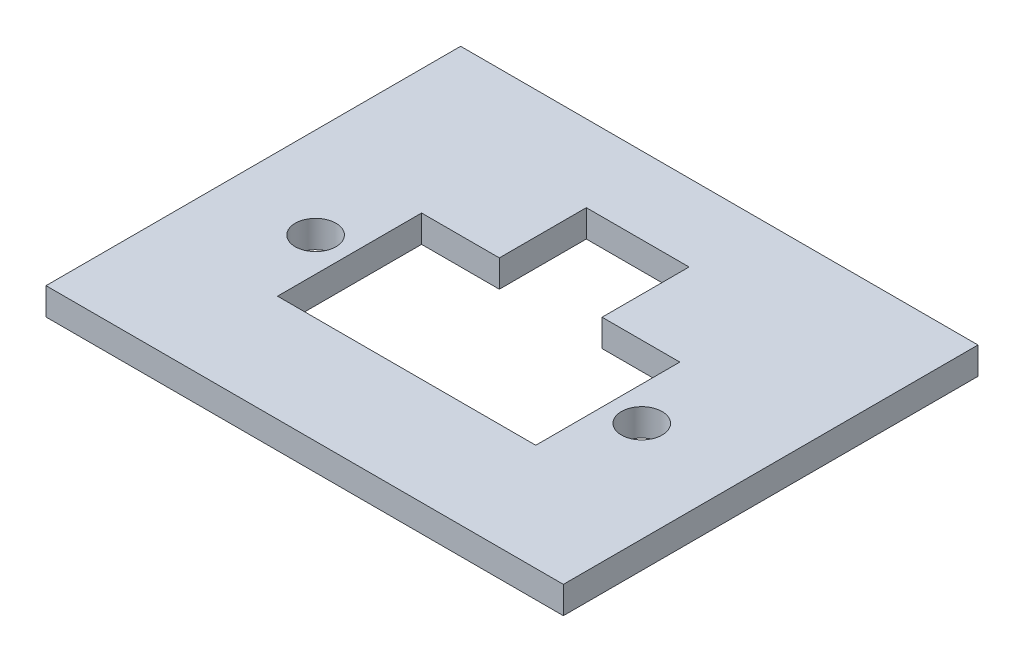
ISO-10303-21;
HEADER;
FILE_DESCRIPTION(('STEP AP214'),'2;1');
FILE_NAME('part.step','',(''),(''),'','','');
FILE_SCHEMA(('AUTOMOTIVE_DESIGN { 1 0 10303 214 1 1 1 1 }'));
ENDSEC;
DATA;
#1=APPLICATION_CONTEXT('core data for automotive mechanical design processes');
#2=APPLICATION_PROTOCOL_DEFINITION('international standard','automotive_design',2000,#1);
#3=PRODUCT_CONTEXT('',#1,'mechanical');
#4=PRODUCT('Part','Part','',(#3));
#5=PRODUCT_RELATED_PRODUCT_CATEGORY('part','',(#4));
#6=PRODUCT_DEFINITION_FORMATION('','',#4);
#7=PRODUCT_DEFINITION_CONTEXT('part definition',#1,'design');
#8=PRODUCT_DEFINITION('design','',#6,#7);
#9=PRODUCT_DEFINITION_SHAPE('','',#8);
#10=(LENGTH_UNIT() NAMED_UNIT(*) SI_UNIT(.MILLI.,.METRE.));
#11=(NAMED_UNIT(*) PLANE_ANGLE_UNIT() SI_UNIT($,.RADIAN.));
#12=(NAMED_UNIT(*) SI_UNIT($,.STERADIAN.) SOLID_ANGLE_UNIT());
#13=UNCERTAINTY_MEASURE_WITH_UNIT(LENGTH_MEASURE(1.E-05),#10,'distance_accuracy_value','');
#14=(GEOMETRIC_REPRESENTATION_CONTEXT(3) GLOBAL_UNCERTAINTY_ASSIGNED_CONTEXT((#13)) GLOBAL_UNIT_ASSIGNED_CONTEXT((#10,
#11,#12)) REPRESENTATION_CONTEXT('',''));
#15=CARTESIAN_POINT('',(0.,0.,0.));
#16=DIRECTION('',(0.,0.,1.));
#17=DIRECTION('',(1.,0.,0.));
#18=AXIS2_PLACEMENT_3D('',#15,#16,#17);
#19=CARTESIAN_POINT('',(0.,2.,-24.6604097019997));
#20=DIRECTION('',(0.,0.,1.));
#21=DIRECTION('',(1.,0.,0.));
#22=AXIS2_PLACEMENT_3D('',#19,#20,#21);
#23=PLANE('',#22);
#24=DIRECTION('',(-1.,0.,0.));
#25=VECTOR('',#24,1.);
#26=CARTESIAN_POINT('',(0.,0.,-24.6604097019997));
#27=LINE('',#26,#25);
#28=CARTESIAN_POINT('',(9.87892857226338,0.,-24.6604097019997));
#29=VERTEX_POINT('',#28);
#30=CARTESIAN_POINT('',(-28.1884503180928,0.,-24.6604097019997));
#31=VERTEX_POINT('',#30);
#32=EDGE_CURVE('E202',#29,#31,#27,.T.);
#33=ORIENTED_EDGE('',*,*,#32,.T.);
#34=DIRECTION('',(0.,-1.,0.));
#35=VECTOR('',#34,1.);
#36=CARTESIAN_POINT('',(-28.1884503180928,2.,-24.6604097019997));
#37=LINE('',#36,#35);
#38=CARTESIAN_POINT('',(-28.1884503180928,2.,-24.6604097019997));
#39=VERTEX_POINT('',#38);
#40=EDGE_CURVE('E12',#39,#31,#37,.T.);
#41=ORIENTED_EDGE('',*,*,#40,.F.);
#42=DIRECTION('',(-1.,0.,0.));
#43=VECTOR('',#42,1.);
#44=CARTESIAN_POINT('',(0.,2.,-24.6604097019997));
#45=LINE('',#44,#43);
#46=CARTESIAN_POINT('',(9.87892857226338,2.,-24.6604097019997));
#47=VERTEX_POINT('',#46);
#48=EDGE_CURVE('E186',#47,#39,#45,.T.);
#49=ORIENTED_EDGE('',*,*,#48,.F.);
#50=DIRECTION('',(0.,-1.,0.));
#51=VECTOR('',#50,1.);
#52=CARTESIAN_POINT('',(9.87892857226338,2.,-24.6604097019997));
#53=LINE('',#52,#51);
#54=EDGE_CURVE('E213',#47,#29,#53,.T.);
#55=ORIENTED_EDGE('',*,*,#54,.T.);
#56=EDGE_LOOP('',(#33,#41,#49,#55));
#57=FACE_BOUND('',#56,.T.);
#58=ADVANCED_FACE('F35',(#57),#23,.F.);
#59=CARTESIAN_POINT('',(-28.1884503180928,2.,0.));
#60=DIRECTION('',(1.,0.,0.));
#61=DIRECTION('',(0.,0.,-1.));
#62=AXIS2_PLACEMENT_3D('',#59,#60,#61);
#63=PLANE('',#62);
#64=DIRECTION('',(0.,0.,1.));
#65=VECTOR('',#64,1.);
#66=CARTESIAN_POINT('',(-28.1884503180928,0.,0.));
#67=LINE('',#66,#65);
#68=CARTESIAN_POINT('',(-28.1884503180928,0.,5.84813558094167));
#69=VERTEX_POINT('',#68);
#70=EDGE_CURVE('E205',#31,#69,#67,.T.);
#71=ORIENTED_EDGE('',*,*,#70,.T.);
#72=DIRECTION('',(0.,-1.,0.));
#73=VECTOR('',#72,1.);
#74=CARTESIAN_POINT('',(-28.1884503180928,2.,5.84813558094167));
#75=LINE('',#74,#73);
#76=CARTESIAN_POINT('',(-28.1884503180928,2.,5.84813558094167));
#77=VERTEX_POINT('',#76);
#78=EDGE_CURVE('E44',#77,#69,#75,.T.);
#79=ORIENTED_EDGE('',*,*,#78,.F.);
#80=DIRECTION('',(0.,0.,1.));
#81=VECTOR('',#80,1.);
#82=CARTESIAN_POINT('',(-28.1884503180928,2.,0.));
#83=LINE('',#82,#81);
#84=EDGE_CURVE('E189',#39,#77,#83,.T.);
#85=ORIENTED_EDGE('',*,*,#84,.F.);
#86=ORIENTED_EDGE('',*,*,#40,.T.);
#87=EDGE_LOOP('',(#71,#79,#85,#86));
#88=FACE_BOUND('',#87,.T.);
#89=ADVANCED_FACE('F256',(#88),#63,.F.);
#90=CARTESIAN_POINT('',(0.,2.,5.84813558094167));
#91=DIRECTION('',(0.,0.,1.));
#92=DIRECTION('',(1.,0.,0.));
#93=AXIS2_PLACEMENT_3D('',#90,#91,#92);
#94=PLANE('',#93);
#95=DIRECTION('',(-1.,0.,0.));
#96=VECTOR('',#95,1.);
#97=CARTESIAN_POINT('',(0.,0.,5.84813558094167));
#98=LINE('',#97,#96);
#99=CARTESIAN_POINT('',(9.87892857226338,0.,5.84813558094167));
#100=VERTEX_POINT('',#99);
#101=EDGE_CURVE('E208',#100,#69,#98,.T.);
#102=ORIENTED_EDGE('',*,*,#101,.F.);
#103=DIRECTION('',(0.,-1.,0.));
#104=VECTOR('',#103,1.);
#105=CARTESIAN_POINT('',(9.87892857226338,2.,5.84813558094167));
#106=LINE('',#105,#104);
#107=CARTESIAN_POINT('',(9.87892857226338,2.,5.84813558094167));
#108=VERTEX_POINT('',#107);
#109=EDGE_CURVE('E215',#108,#100,#106,.T.);
#110=ORIENTED_EDGE('',*,*,#109,.F.);
#111=DIRECTION('',(-1.,0.,0.));
#112=VECTOR('',#111,1.);
#113=CARTESIAN_POINT('',(0.,2.,5.84813558094167));
#114=LINE('',#113,#112);
#115=EDGE_CURVE('E191',#108,#77,#114,.T.);
#116=ORIENTED_EDGE('',*,*,#115,.T.);
#117=ORIENTED_EDGE('',*,*,#78,.T.);
#118=EDGE_LOOP('',(#102,#110,#116,#117));
#119=FACE_BOUND('',#118,.T.);
#120=ADVANCED_FACE('F262',(#119),#94,.T.);
#121=CARTESIAN_POINT('',(-13.28,2.,0.));
#122=DIRECTION('',(1.,0.,0.));
#123=DIRECTION('',(0.,0.,-1.));
#124=AXIS2_PLACEMENT_3D('',#121,#122,#123);
#125=PLANE('',#124);
#126=DIRECTION('',(0.,0.,1.));
#127=VECTOR('',#126,1.);
#128=CARTESIAN_POINT('',(-13.28,0.,0.));
#129=LINE('',#128,#127);
#130=CARTESIAN_POINT('',(-13.28,0.,-19.));
#131=VERTEX_POINT('',#130);
#132=CARTESIAN_POINT('',(-13.28,0.,-12.6));
#133=VERTEX_POINT('',#132);
#134=EDGE_CURVE('E173',#131,#133,#129,.T.);
#135=ORIENTED_EDGE('',*,*,#134,.F.);
#136=DIRECTION('',(0.,-1.,0.));
#137=VECTOR('',#136,1.);
#138=CARTESIAN_POINT('',(-13.28,2.,-19.));
#139=LINE('',#138,#137);
#140=CARTESIAN_POINT('',(-13.28,2.,-19.));
#141=VERTEX_POINT('',#140);
#142=EDGE_CURVE('E216',#141,#131,#139,.T.);
#143=ORIENTED_EDGE('',*,*,#142,.F.);
#144=DIRECTION('',(0.,0.,1.));
#145=VECTOR('',#144,1.);
#146=CARTESIAN_POINT('',(-13.28,2.,0.));
#147=LINE('',#146,#145);
#148=CARTESIAN_POINT('',(-13.28,2.,-12.6));
#149=VERTEX_POINT('',#148);
#150=EDGE_CURVE('E176',#141,#149,#147,.T.);
#151=ORIENTED_EDGE('',*,*,#150,.T.);
#152=DIRECTION('',(0.,-1.,0.));
#153=VECTOR('',#152,1.);
#154=CARTESIAN_POINT('',(-13.28,21.1049731745428,-12.6));
#155=LINE('',#154,#153);
#156=EDGE_CURVE('E166',#149,#133,#155,.T.);
#157=ORIENTED_EDGE('',*,*,#156,.T.);
#158=EDGE_LOOP('',(#135,#143,#151,#157));
#159=FACE_BOUND('',#158,.T.);
#160=ADVANCED_FACE('F37',(#159),#125,.T.);
#161=CARTESIAN_POINT('',(0.,2.,-19.));
#162=DIRECTION('',(0.,0.,-1.));
#163=DIRECTION('',(-1.,0.,0.));
#164=AXIS2_PLACEMENT_3D('',#161,#162,#163);
#165=PLANE('',#164);
#166=DIRECTION('',(1.,0.,0.));
#167=VECTOR('',#166,1.);
#168=CARTESIAN_POINT('',(0.,0.,-19.));
#169=LINE('',#168,#167);
#170=CARTESIAN_POINT('',(-5.72,0.,-19.));
#171=VERTEX_POINT('',#170);
#172=EDGE_CURVE('E139',#131,#171,#169,.T.);
#173=ORIENTED_EDGE('',*,*,#172,.T.);
#174=DIRECTION('',(0.,-1.,0.));
#175=VECTOR('',#174,1.);
#176=CARTESIAN_POINT('',(-5.72,2.,-19.));
#177=LINE('',#176,#175);
#178=CARTESIAN_POINT('',(-5.72,2.,-19.));
#179=VERTEX_POINT('',#178);
#180=EDGE_CURVE('E134',#179,#171,#177,.T.);
#181=ORIENTED_EDGE('',*,*,#180,.F.);
#182=DIRECTION('',(1.,0.,0.));
#183=VECTOR('',#182,1.);
#184=CARTESIAN_POINT('',(0.,2.,-19.));
#185=LINE('',#184,#183);
#186=EDGE_CURVE('E178',#141,#179,#185,.T.);
#187=ORIENTED_EDGE('',*,*,#186,.F.);
#188=ORIENTED_EDGE('',*,*,#142,.T.);
#189=EDGE_LOOP('',(#173,#181,#187,#188));
#190=FACE_BOUND('',#189,.T.);
#191=ADVANCED_FACE('F274',(#190),#165,.F.);
#192=CARTESIAN_POINT('',(-5.72,2.,0.));
#193=DIRECTION('',(1.,0.,0.));
#194=DIRECTION('',(0.,0.,-1.));
#195=AXIS2_PLACEMENT_3D('',#192,#193,#194);
#196=PLANE('',#195);
#197=DIRECTION('',(0.,0.,1.));
#198=VECTOR('',#197,1.);
#199=CARTESIAN_POINT('',(-5.72,0.,0.));
#200=LINE('',#199,#198);
#201=CARTESIAN_POINT('',(-5.72,0.,-12.6));
#202=VERTEX_POINT('',#201);
#203=EDGE_CURVE('E127',#171,#202,#200,.T.);
#204=ORIENTED_EDGE('',*,*,#203,.T.);
#205=DIRECTION('',(0.,-1.,0.));
#206=VECTOR('',#205,1.);
#207=CARTESIAN_POINT('',(-5.72,21.1049731745428,-12.6));
#208=LINE('',#207,#206);
#209=CARTESIAN_POINT('',(-5.72,2.,-12.6));
#210=VERTEX_POINT('',#209);
#211=EDGE_CURVE('E131',#210,#202,#208,.T.);
#212=ORIENTED_EDGE('',*,*,#211,.F.);
#213=DIRECTION('',(0.,0.,1.));
#214=VECTOR('',#213,1.);
#215=CARTESIAN_POINT('',(-5.72,2.,0.));
#216=LINE('',#215,#214);
#217=EDGE_CURVE('E181',#179,#210,#216,.T.);
#218=ORIENTED_EDGE('',*,*,#217,.F.);
#219=ORIENTED_EDGE('',*,*,#180,.T.);
#220=EDGE_LOOP('',(#204,#212,#218,#219));
#221=FACE_BOUND('',#220,.T.);
#222=ADVANCED_FACE('F129',(#221),#196,.F.);
#223=CARTESIAN_POINT('',(0.,2.,0.));
#224=DIRECTION('',(1.,0.,0.));
#225=DIRECTION('',(0.,0.,-1.));
#226=AXIS2_PLACEMENT_3D('',#223,#224,#225);
#227=PLANE('',#226);
#228=DIRECTION('',(0.,0.,1.));
#229=VECTOR('',#228,1.);
#230=CARTESIAN_POINT('',(0.,0.,0.));
#231=LINE('',#230,#229);
#232=CARTESIAN_POINT('',(0.,0.,-12.6));
#233=VERTEX_POINT('',#232);
#234=CARTESIAN_POINT('',(0.,0.,-2.));
#235=VERTEX_POINT('',#234);
#236=EDGE_CURVE('E138',#233,#235,#231,.T.);
#237=ORIENTED_EDGE('',*,*,#236,.T.);
#238=DIRECTION('',(0.,-1.,0.));
#239=VECTOR('',#238,1.);
#240=CARTESIAN_POINT('',(0.,21.1049731745428,-2.));
#241=LINE('',#240,#239);
#242=CARTESIAN_POINT('',(0.,2.,-2.));
#243=VERTEX_POINT('',#242);
#244=EDGE_CURVE('E60',#243,#235,#241,.T.);
#245=ORIENTED_EDGE('',*,*,#244,.F.);
#246=DIRECTION('',(0.,0.,1.));
#247=VECTOR('',#246,1.);
#248=CARTESIAN_POINT('',(0.,2.,0.));
#249=LINE('',#248,#247);
#250=CARTESIAN_POINT('',(0.,2.,-12.6));
#251=VERTEX_POINT('',#250);
#252=EDGE_CURVE('E183',#251,#243,#249,.T.);
#253=ORIENTED_EDGE('',*,*,#252,.F.);
#254=DIRECTION('',(0.,-1.,0.));
#255=VECTOR('',#254,1.);
#256=CARTESIAN_POINT('',(0.,21.1049731745428,-12.6));
#257=LINE('',#256,#255);
#258=EDGE_CURVE('E155',#251,#233,#257,.T.);
#259=ORIENTED_EDGE('',*,*,#258,.T.);
#260=EDGE_LOOP('',(#237,#245,#253,#259));
#261=FACE_BOUND('',#260,.T.);
#262=ADVANCED_FACE('F270',(#261),#227,.F.);
#263=CARTESIAN_POINT('',(-19.,2.,0.));
#264=DIRECTION('',(-1.,0.,0.));
#265=DIRECTION('',(0.,0.,1.));
#266=AXIS2_PLACEMENT_3D('',#263,#264,#265);
#267=PLANE('',#266);
#268=DIRECTION('',(0.,0.,-1.));
#269=VECTOR('',#268,1.);
#270=CARTESIAN_POINT('',(-19.,2.,0.));
#271=LINE('',#270,#269);
#272=CARTESIAN_POINT('',(-19.,2.,-2.));
#273=VERTEX_POINT('',#272);
#274=CARTESIAN_POINT('',(-19.,2.,-12.6));
#275=VERTEX_POINT('',#274);
#276=EDGE_CURVE('E52',#273,#275,#271,.T.);
#277=ORIENTED_EDGE('',*,*,#276,.F.);
#278=DIRECTION('',(0.,-1.,0.));
#279=VECTOR('',#278,1.);
#280=CARTESIAN_POINT('',(-19.,21.1049731745428,-2.));
#281=LINE('',#280,#279);
#282=CARTESIAN_POINT('',(-19.,0.,-2.));
#283=VERTEX_POINT('',#282);
#284=EDGE_CURVE('E162',#273,#283,#281,.T.);
#285=ORIENTED_EDGE('',*,*,#284,.T.);
#286=DIRECTION('',(0.,0.,-1.));
#287=VECTOR('',#286,1.);
#288=CARTESIAN_POINT('',(-19.,0.,0.));
#289=LINE('',#288,#287);
#290=CARTESIAN_POINT('',(-19.,0.,-12.6));
#291=VERTEX_POINT('',#290);
#292=EDGE_CURVE('E200',#283,#291,#289,.T.);
#293=ORIENTED_EDGE('',*,*,#292,.T.);
#294=DIRECTION('',(0.,-1.,0.));
#295=VECTOR('',#294,1.);
#296=CARTESIAN_POINT('',(-19.,21.1049731745428,-12.6));
#297=LINE('',#296,#295);
#298=EDGE_CURVE('E170',#275,#291,#297,.T.);
#299=ORIENTED_EDGE('',*,*,#298,.F.);
#300=EDGE_LOOP('',(#277,#285,#293,#299));
#301=FACE_BOUND('',#300,.T.);
#302=ADVANCED_FACE('F239',(#301),#267,.F.);
#303=CARTESIAN_POINT('',(9.87892857226338,2.,0.));
#304=DIRECTION('',(1.,0.,0.));
#305=DIRECTION('',(0.,0.,-1.));
#306=AXIS2_PLACEMENT_3D('',#303,#304,#305);
#307=PLANE('',#306);
#308=DIRECTION('',(0.,0.,1.));
#309=VECTOR('',#308,1.);
#310=CARTESIAN_POINT('',(9.87892857226338,0.,0.));
#311=LINE('',#310,#309);
#312=EDGE_CURVE('E179',#29,#100,#311,.T.);
#313=ORIENTED_EDGE('',*,*,#312,.F.);
#314=ORIENTED_EDGE('',*,*,#54,.F.);
#315=DIRECTION('',(0.,0.,1.));
#316=VECTOR('',#315,1.);
#317=CARTESIAN_POINT('',(9.87892857226338,2.,0.));
#318=LINE('',#317,#316);
#319=EDGE_CURVE('E194',#47,#108,#318,.T.);
#320=ORIENTED_EDGE('',*,*,#319,.T.);
#321=ORIENTED_EDGE('',*,*,#109,.T.);
#322=EDGE_LOOP('',(#313,#314,#320,#321));
#323=FACE_BOUND('',#322,.T.);
#324=ADVANCED_FACE('F269',(#323),#307,.T.);
#325=CARTESIAN_POINT('',(0.,2.,0.));
#326=DIRECTION('',(0.,1.,0.));
#327=DIRECTION('',(0.,0.,1.));
#328=AXIS2_PLACEMENT_3D('',#325,#326,#327);
#329=PLANE('',#328);
#330=CARTESIAN_POINT('',(-21.5,2.,-7.3));
#331=DIRECTION('',(0.,1.,0.));
#332=DIRECTION('',(0.,0.,1.));
#333=AXIS2_PLACEMENT_3D('',#330,#331,#332);
#334=CIRCLE('',#333,1.5);
#335=CARTESIAN_POINT('',(-21.5,2.,-5.8));
#336=VERTEX_POINT('',#335);
#337=EDGE_CURVE('E222',#336,#336,#334,.T.);
#338=ORIENTED_EDGE('',*,*,#337,.F.);
#339=EDGE_LOOP('',(#338));
#340=FACE_BOUND('',#339,.T.);
#341=CARTESIAN_POINT('',(2.5,2.,-7.3));
#342=DIRECTION('',(0.,1.,0.));
#343=DIRECTION('',(0.,0.,1.));
#344=AXIS2_PLACEMENT_3D('',#341,#342,#343);
#345=CIRCLE('',#344,1.5);
#346=CARTESIAN_POINT('',(2.5,2.,-5.8));
#347=VERTEX_POINT('',#346);
#348=EDGE_CURVE('E228',#347,#347,#345,.T.);
#349=ORIENTED_EDGE('',*,*,#348,.F.);
#350=EDGE_LOOP('',(#349));
#351=FACE_BOUND('',#350,.T.);
#352=DIRECTION('',(1.,0.,0.));
#353=VECTOR('',#352,1.);
#354=CARTESIAN_POINT('',(0.,2.,-2.));
#355=LINE('',#354,#353);
#356=EDGE_CURVE('E158',#273,#243,#355,.T.);
#357=ORIENTED_EDGE('',*,*,#356,.F.);
#358=ORIENTED_EDGE('',*,*,#276,.T.);
#359=DIRECTION('',(-1.,0.,0.));
#360=VECTOR('',#359,1.);
#361=CARTESIAN_POINT('',(-19.,2.,-12.6));
#362=LINE('',#361,#360);
#363=EDGE_CURVE('E167',#149,#275,#362,.T.);
#364=ORIENTED_EDGE('',*,*,#363,.F.);
#365=ORIENTED_EDGE('',*,*,#150,.F.);
#366=ORIENTED_EDGE('',*,*,#186,.T.);
#367=ORIENTED_EDGE('',*,*,#217,.T.);
#368=DIRECTION('',(-1.,0.,0.));
#369=VECTOR('',#368,1.);
#370=CARTESIAN_POINT('',(-5.72,2.,-12.6));
#371=LINE('',#370,#369);
#372=EDGE_CURVE('E147',#251,#210,#371,.T.);
#373=ORIENTED_EDGE('',*,*,#372,.F.);
#374=ORIENTED_EDGE('',*,*,#252,.T.);
#375=EDGE_LOOP('',(#357,#358,#364,#365,#366,#367,#373,#374));
#376=FACE_BOUND('',#375,.T.);
#377=ORIENTED_EDGE('',*,*,#48,.T.);
#378=ORIENTED_EDGE('',*,*,#84,.T.);
#379=ORIENTED_EDGE('',*,*,#115,.F.);
#380=ORIENTED_EDGE('',*,*,#319,.F.);
#381=EDGE_LOOP('',(#377,#378,#379,#380));
#382=FACE_BOUND('',#381,.T.);
#383=ADVANCED_FACE('F288',(#340,#351,#376,#382),#329,.T.);
#384=CARTESIAN_POINT('',(0.,0.,0.));
#385=DIRECTION('',(0.,1.,0.));
#386=DIRECTION('',(0.,0.,1.));
#387=AXIS2_PLACEMENT_3D('',#384,#385,#386);
#388=PLANE('',#387);
#389=CARTESIAN_POINT('',(-21.5,0.,-7.3));
#390=DIRECTION('',(0.,1.,0.));
#391=DIRECTION('',(0.,0.,1.));
#392=AXIS2_PLACEMENT_3D('',#389,#390,#391);
#393=CIRCLE('',#392,1.5);
#394=CARTESIAN_POINT('',(-21.5,0.,-5.8));
#395=VERTEX_POINT('',#394);
#396=EDGE_CURVE('E39',#395,#395,#393,.T.);
#397=ORIENTED_EDGE('',*,*,#396,.T.);
#398=EDGE_LOOP('',(#397));
#399=FACE_BOUND('',#398,.T.);
#400=CARTESIAN_POINT('',(2.5,0.,-7.3));
#401=DIRECTION('',(0.,1.,0.));
#402=DIRECTION('',(0.,0.,1.));
#403=AXIS2_PLACEMENT_3D('',#400,#401,#402);
#404=CIRCLE('',#403,1.5);
#405=CARTESIAN_POINT('',(2.5,0.,-5.8));
#406=VERTEX_POINT('',#405);
#407=EDGE_CURVE('E220',#406,#406,#404,.T.);
#408=ORIENTED_EDGE('',*,*,#407,.T.);
#409=EDGE_LOOP('',(#408));
#410=FACE_BOUND('',#409,.T.);
#411=ORIENTED_EDGE('',*,*,#292,.F.);
#412=DIRECTION('',(1.,0.,0.));
#413=VECTOR('',#412,1.);
#414=CARTESIAN_POINT('',(0.,0.,-2.));
#415=LINE('',#414,#413);
#416=EDGE_CURVE('E226',#283,#235,#415,.T.);
#417=ORIENTED_EDGE('',*,*,#416,.T.);
#418=ORIENTED_EDGE('',*,*,#236,.F.);
#419=DIRECTION('',(-1.,0.,0.));
#420=VECTOR('',#419,1.);
#421=CARTESIAN_POINT('',(-5.72,0.,-12.6));
#422=LINE('',#421,#420);
#423=EDGE_CURVE('E145',#233,#202,#422,.T.);
#424=ORIENTED_EDGE('',*,*,#423,.T.);
#425=ORIENTED_EDGE('',*,*,#203,.F.);
#426=ORIENTED_EDGE('',*,*,#172,.F.);
#427=ORIENTED_EDGE('',*,*,#134,.T.);
#428=DIRECTION('',(-1.,0.,0.));
#429=VECTOR('',#428,1.);
#430=CARTESIAN_POINT('',(-19.,0.,-12.6));
#431=LINE('',#430,#429);
#432=EDGE_CURVE('E148',#133,#291,#431,.T.);
#433=ORIENTED_EDGE('',*,*,#432,.T.);
#434=EDGE_LOOP('',(#411,#417,#418,#424,#425,#426,#427,#433));
#435=FACE_BOUND('',#434,.T.);
#436=ORIENTED_EDGE('',*,*,#32,.F.);
#437=ORIENTED_EDGE('',*,*,#312,.T.);
#438=ORIENTED_EDGE('',*,*,#101,.T.);
#439=ORIENTED_EDGE('',*,*,#70,.F.);
#440=EDGE_LOOP('',(#436,#437,#438,#439));
#441=FACE_BOUND('',#440,.T.);
#442=ADVANCED_FACE('F151',(#399,#410,#435,#441),#388,.F.);
#443=CARTESIAN_POINT('',(-19.,21.1049731745428,-12.6));
#444=DIRECTION('',(0.,0.,1.));
#445=DIRECTION('',(1.,0.,0.));
#446=AXIS2_PLACEMENT_3D('',#443,#444,#445);
#447=PLANE('',#446);
#448=ORIENTED_EDGE('',*,*,#156,.F.);
#449=ORIENTED_EDGE('',*,*,#363,.T.);
#450=ORIENTED_EDGE('',*,*,#298,.T.);
#451=ORIENTED_EDGE('',*,*,#432,.F.);
#452=EDGE_LOOP('',(#448,#449,#450,#451));
#453=FACE_BOUND('',#452,.T.);
#454=ADVANCED_FACE('F253',(#453),#447,.T.);
#455=CARTESIAN_POINT('',(-5.72,21.1049731745428,-12.6));
#456=DIRECTION('',(0.,0.,1.));
#457=DIRECTION('',(1.,0.,0.));
#458=AXIS2_PLACEMENT_3D('',#455,#456,#457);
#459=PLANE('',#458);
#460=ORIENTED_EDGE('',*,*,#258,.F.);
#461=ORIENTED_EDGE('',*,*,#372,.T.);
#462=ORIENTED_EDGE('',*,*,#211,.T.);
#463=ORIENTED_EDGE('',*,*,#423,.F.);
#464=EDGE_LOOP('',(#460,#461,#462,#463));
#465=FACE_BOUND('',#464,.T.);
#466=ADVANCED_FACE('F144',(#465),#459,.T.);
#467=CARTESIAN_POINT('',(0.,21.1049731745428,-2.));
#468=DIRECTION('',(0.,0.,-1.));
#469=DIRECTION('',(-1.,0.,0.));
#470=AXIS2_PLACEMENT_3D('',#467,#468,#469);
#471=PLANE('',#470);
#472=ORIENTED_EDGE('',*,*,#284,.F.);
#473=ORIENTED_EDGE('',*,*,#356,.T.);
#474=ORIENTED_EDGE('',*,*,#244,.T.);
#475=ORIENTED_EDGE('',*,*,#416,.F.);
#476=EDGE_LOOP('',(#472,#473,#474,#475));
#477=FACE_BOUND('',#476,.T.);
#478=ADVANCED_FACE('F242',(#477),#471,.T.);
#479=CARTESIAN_POINT('',(2.5,-8.,-7.3));
#480=DIRECTION('',(0.,1.,0.));
#481=DIRECTION('',(0.,0.,1.));
#482=AXIS2_PLACEMENT_3D('',#479,#480,#481);
#483=CYLINDRICAL_SURFACE('',#482,1.5);
#484=ORIENTED_EDGE('',*,*,#348,.T.);
#485=EDGE_LOOP('',(#484));
#486=FACE_BOUND('',#485,.T.);
#487=ORIENTED_EDGE('',*,*,#407,.F.);
#488=EDGE_LOOP('',(#487));
#489=FACE_BOUND('',#488,.T.);
#490=ADVANCED_FACE('F244',(#486,#489),#483,.F.);
#491=CARTESIAN_POINT('',(-21.5,-8.,-7.3));
#492=DIRECTION('',(0.,1.,0.));
#493=DIRECTION('',(0.,0.,1.));
#494=AXIS2_PLACEMENT_3D('',#491,#492,#493);
#495=CYLINDRICAL_SURFACE('',#494,1.5);
#496=ORIENTED_EDGE('',*,*,#337,.T.);
#497=EDGE_LOOP('',(#496));
#498=FACE_BOUND('',#497,.T.);
#499=ORIENTED_EDGE('',*,*,#396,.F.);
#500=EDGE_LOOP('',(#499));
#501=FACE_BOUND('',#500,.T.);
#502=ADVANCED_FACE('F250',(#498,#501),#495,.F.);
#503=CLOSED_SHELL('',(#58,#89,#120,#160,#191,#222,#262,#302,#324,#383,#442,#454,#466,#478,#490,#502));
#504=MANIFOLD_SOLID_BREP('B2',#503);
#505=ADVANCED_BREP_SHAPE_REPRESENTATION('',(#18,#504),#14);
#506=SHAPE_DEFINITION_REPRESENTATION(#9,#505);
ENDSEC;
END-ISO-10303-21;
